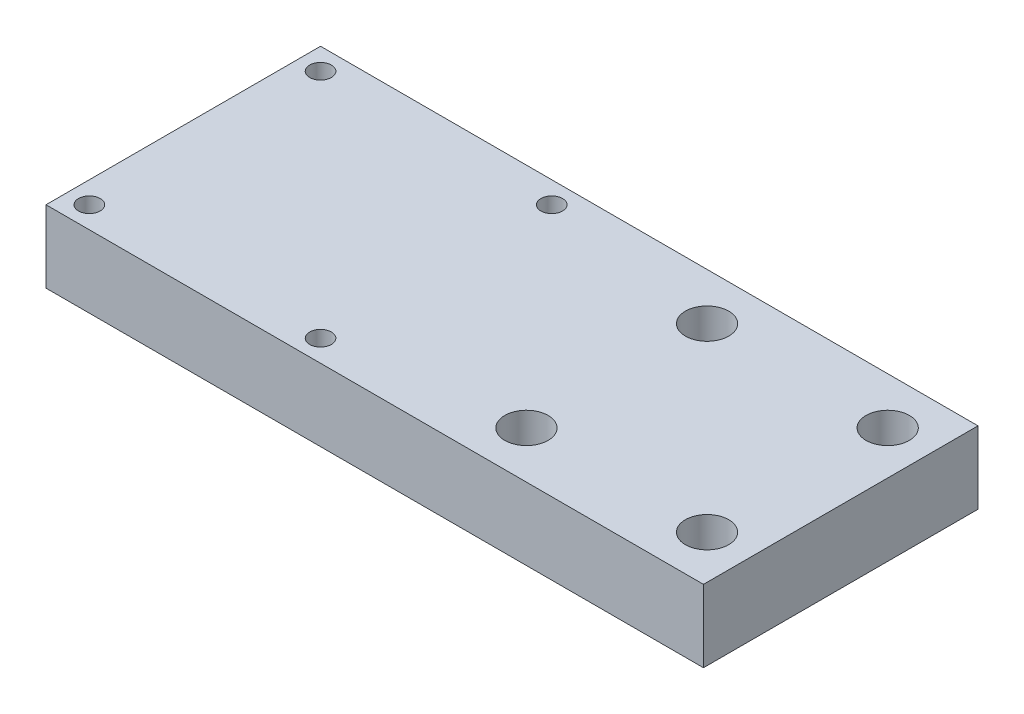
ISO-10303-21;
HEADER;
FILE_DESCRIPTION(('STEP AP214'),'2;1');
FILE_NAME('part.step','',(''),(''),'','','');
FILE_SCHEMA(('AUTOMOTIVE_DESIGN { 1 0 10303 214 1 1 1 1 }'));
ENDSEC;
DATA;
#1=APPLICATION_CONTEXT('core data for automotive mechanical design processes');
#2=APPLICATION_PROTOCOL_DEFINITION('international standard','automotive_design',2000,#1);
#3=PRODUCT_CONTEXT('',#1,'mechanical');
#4=PRODUCT('Part','Part','',(#3));
#5=PRODUCT_RELATED_PRODUCT_CATEGORY('part','',(#4));
#6=PRODUCT_DEFINITION_FORMATION('','',#4);
#7=PRODUCT_DEFINITION_CONTEXT('part definition',#1,'design');
#8=PRODUCT_DEFINITION('design','',#6,#7);
#9=PRODUCT_DEFINITION_SHAPE('','',#8);
#10=(LENGTH_UNIT() NAMED_UNIT(*) SI_UNIT(.MILLI.,.METRE.));
#11=(NAMED_UNIT(*) PLANE_ANGLE_UNIT() SI_UNIT($,.RADIAN.));
#12=(NAMED_UNIT(*) SI_UNIT($,.STERADIAN.) SOLID_ANGLE_UNIT());
#13=UNCERTAINTY_MEASURE_WITH_UNIT(LENGTH_MEASURE(1.E-05),#10,'distance_accuracy_value','');
#14=(GEOMETRIC_REPRESENTATION_CONTEXT(3) GLOBAL_UNCERTAINTY_ASSIGNED_CONTEXT((#13)) GLOBAL_UNIT_ASSIGNED_CONTEXT((#10,
#11,#12)) REPRESENTATION_CONTEXT('',''));
#15=CARTESIAN_POINT('',(0.,0.,0.));
#16=DIRECTION('',(0.,0.,1.));
#17=DIRECTION('',(1.,0.,0.));
#18=AXIS2_PLACEMENT_3D('',#15,#16,#17);
#19=CARTESIAN_POINT('',(0.,10.,0.));
#20=DIRECTION('',(0.,-1.,0.));
#21=DIRECTION('',(0.,0.,-1.));
#22=AXIS2_PLACEMENT_3D('',#19,#20,#21);
#23=PLANE('',#22);
#24=DIRECTION('',(0.,0.,1.));
#25=VECTOR('',#24,1.);
#26=CARTESIAN_POINT('',(-18.9695021838503,10.,35.35946325853));
#27=LINE('',#26,#25);
#28=CARTESIAN_POINT('',(-18.9695021838503,10.,-2.64053674146996));
#29=VERTEX_POINT('',#28);
#30=CARTESIAN_POINT('',(-18.9695021838503,10.,35.35946325853));
#31=VERTEX_POINT('',#30);
#32=EDGE_CURVE('E84',#29,#31,#27,.T.);
#33=ORIENTED_EDGE('',*,*,#32,.T.);
#34=DIRECTION('',(1.,0.,0.));
#35=VECTOR('',#34,1.);
#36=CARTESIAN_POINT('',(-18.9695021838503,10.,35.35946325853));
#37=LINE('',#36,#35);
#38=CARTESIAN_POINT('',(72.0304978161497,10.,35.35946325853));
#39=VERTEX_POINT('',#38);
#40=EDGE_CURVE('E79',#31,#39,#37,.T.);
#41=ORIENTED_EDGE('',*,*,#40,.T.);
#42=DIRECTION('',(0.,0.,-1.));
#43=VECTOR('',#42,1.);
#44=CARTESIAN_POINT('',(72.0304978161497,10.,35.35946325853));
#45=LINE('',#44,#43);
#46=CARTESIAN_POINT('',(72.0304978161497,10.,-2.64053674146996));
#47=VERTEX_POINT('',#46);
#48=EDGE_CURVE('E82',#39,#47,#45,.T.);
#49=ORIENTED_EDGE('',*,*,#48,.T.);
#50=DIRECTION('',(-1.,0.,0.));
#51=VECTOR('',#50,1.);
#52=CARTESIAN_POINT('',(-18.9695021838503,10.,-2.64053674146996));
#53=LINE('',#52,#51);
#54=EDGE_CURVE('E49',#47,#29,#53,.T.);
#55=ORIENTED_EDGE('',*,*,#54,.T.);
#56=EDGE_LOOP('',(#33,#41,#49,#55));
#57=FACE_BOUND('',#56,.T.);
#58=CARTESIAN_POINT('',(-15.9695021838503,10.,0.359463258530042));
#59=DIRECTION('',(0.,1.,0.));
#60=DIRECTION('',(0.,0.,1.));
#61=AXIS2_PLACEMENT_3D('',#58,#59,#60);
#62=CIRCLE('',#61,1.5);
#63=CARTESIAN_POINT('',(-15.9695021838503,10.,1.85946325853004));
#64=VERTEX_POINT('',#63);
#65=EDGE_CURVE('E99',#64,#64,#62,.T.);
#66=ORIENTED_EDGE('',*,*,#65,.F.);
#67=EDGE_LOOP('',(#66));
#68=FACE_BOUND('',#67,.T.);
#69=CARTESIAN_POINT('',(16.0304978161497,10.,0.359463258530042));
#70=DIRECTION('',(0.,1.,0.));
#71=DIRECTION('',(0.,0.,1.));
#72=AXIS2_PLACEMENT_3D('',#69,#70,#71);
#73=CIRCLE('',#72,1.5);
#74=CARTESIAN_POINT('',(16.0304978161497,10.,1.85946325853004));
#75=VERTEX_POINT('',#74);
#76=EDGE_CURVE('E114',#75,#75,#73,.T.);
#77=ORIENTED_EDGE('',*,*,#76,.F.);
#78=EDGE_LOOP('',(#77));
#79=FACE_BOUND('',#78,.T.);
#80=CARTESIAN_POINT('',(16.0304978161497,10.,32.35946325853));
#81=DIRECTION('',(0.,1.,0.));
#82=DIRECTION('',(0.,0.,1.));
#83=AXIS2_PLACEMENT_3D('',#80,#81,#82);
#84=CIRCLE('',#83,1.5);
#85=CARTESIAN_POINT('',(16.0304978161497,10.,33.85946325853));
#86=VERTEX_POINT('',#85);
#87=EDGE_CURVE('E120',#86,#86,#84,.T.);
#88=ORIENTED_EDGE('',*,*,#87,.F.);
#89=EDGE_LOOP('',(#88));
#90=FACE_BOUND('',#89,.T.);
#91=CARTESIAN_POINT('',(-15.9695021838503,10.,32.35946325853));
#92=DIRECTION('',(0.,1.,0.));
#93=DIRECTION('',(0.,0.,1.));
#94=AXIS2_PLACEMENT_3D('',#91,#92,#93);
#95=CIRCLE('',#94,1.5);
#96=CARTESIAN_POINT('',(-15.9695021838503,10.,33.85946325853));
#97=VERTEX_POINT('',#96);
#98=EDGE_CURVE('E126',#97,#97,#95,.T.);
#99=ORIENTED_EDGE('',*,*,#98,.F.);
#100=EDGE_LOOP('',(#99));
#101=FACE_BOUND('',#100,.T.);
#102=CARTESIAN_POINT('',(41.0304978161497,10.,3.85946325853004));
#103=DIRECTION('',(0.,1.,0.));
#104=DIRECTION('',(0.,0.,1.));
#105=AXIS2_PLACEMENT_3D('',#102,#103,#104);
#106=CIRCLE('',#105,3.00000000000001);
#107=CARTESIAN_POINT('',(41.0304978161497,10.,6.85946325853004));
#108=VERTEX_POINT('',#107);
#109=EDGE_CURVE('E132',#108,#108,#106,.T.);
#110=ORIENTED_EDGE('',*,*,#109,.F.);
#111=EDGE_LOOP('',(#110));
#112=FACE_BOUND('',#111,.T.);
#113=CARTESIAN_POINT('',(66.0304978161497,10.,3.85946325853004));
#114=DIRECTION('',(0.,1.,0.));
#115=DIRECTION('',(0.,0.,1.));
#116=AXIS2_PLACEMENT_3D('',#113,#114,#115);
#117=CIRCLE('',#116,3.00000000000001);
#118=CARTESIAN_POINT('',(66.0304978161497,10.,6.85946325853004));
#119=VERTEX_POINT('',#118);
#120=EDGE_CURVE('E138',#119,#119,#117,.T.);
#121=ORIENTED_EDGE('',*,*,#120,.F.);
#122=EDGE_LOOP('',(#121));
#123=FACE_BOUND('',#122,.T.);
#124=CARTESIAN_POINT('',(66.0304978161497,10.,28.85946325853));
#125=DIRECTION('',(0.,1.,0.));
#126=DIRECTION('',(0.,0.,1.));
#127=AXIS2_PLACEMENT_3D('',#124,#125,#126);
#128=CIRCLE('',#127,3.00000000000001);
#129=CARTESIAN_POINT('',(66.0304978161497,10.,31.85946325853));
#130=VERTEX_POINT('',#129);
#131=EDGE_CURVE('E144',#130,#130,#128,.T.);
#132=ORIENTED_EDGE('',*,*,#131,.F.);
#133=EDGE_LOOP('',(#132));
#134=FACE_BOUND('',#133,.T.);
#135=CARTESIAN_POINT('',(41.0304978161497,10.,28.85946325853));
#136=DIRECTION('',(0.,1.,0.));
#137=DIRECTION('',(0.,0.,1.));
#138=AXIS2_PLACEMENT_3D('',#135,#136,#137);
#139=CIRCLE('',#138,3.00000000000001);
#140=CARTESIAN_POINT('',(41.0304978161497,10.,31.85946325853));
#141=VERTEX_POINT('',#140);
#142=EDGE_CURVE('E150',#141,#141,#139,.T.);
#143=ORIENTED_EDGE('',*,*,#142,.F.);
#144=EDGE_LOOP('',(#143));
#145=FACE_BOUND('',#144,.T.);
#146=ADVANCED_FACE('F32',(#57,#68,#79,#90,#101,#112,#123,#134,#145),#23,.F.);
#147=CARTESIAN_POINT('',(0.,0.,0.));
#148=DIRECTION('',(0.,-1.,0.));
#149=DIRECTION('',(0.,0.,-1.));
#150=AXIS2_PLACEMENT_3D('',#147,#148,#149);
#151=PLANE('',#150);
#152=CARTESIAN_POINT('',(66.0304978161497,0.,28.85946325853));
#153=DIRECTION('',(0.,1.,0.));
#154=DIRECTION('',(0.,0.,1.));
#155=AXIS2_PLACEMENT_3D('',#152,#153,#154);
#156=CIRCLE('',#155,3.00000000000001);
#157=CARTESIAN_POINT('',(66.0304978161497,0.,31.85946325853));
#158=VERTEX_POINT('',#157);
#159=EDGE_CURVE('E147',#158,#158,#156,.T.);
#160=ORIENTED_EDGE('',*,*,#159,.T.);
#161=EDGE_LOOP('',(#160));
#162=FACE_BOUND('',#161,.T.);
#163=CARTESIAN_POINT('',(41.0304978161497,0.,3.85946325853004));
#164=DIRECTION('',(0.,1.,0.));
#165=DIRECTION('',(0.,0.,1.));
#166=AXIS2_PLACEMENT_3D('',#163,#164,#165);
#167=CIRCLE('',#166,3.00000000000001);
#168=CARTESIAN_POINT('',(41.0304978161497,0.,6.85946325853004));
#169=VERTEX_POINT('',#168);
#170=EDGE_CURVE('E135',#169,#169,#167,.T.);
#171=ORIENTED_EDGE('',*,*,#170,.T.);
#172=EDGE_LOOP('',(#171));
#173=FACE_BOUND('',#172,.T.);
#174=CARTESIAN_POINT('',(16.0304978161497,0.,32.35946325853));
#175=DIRECTION('',(0.,1.,0.));
#176=DIRECTION('',(0.,0.,1.));
#177=AXIS2_PLACEMENT_3D('',#174,#175,#176);
#178=CIRCLE('',#177,1.5);
#179=CARTESIAN_POINT('',(16.0304978161497,0.,33.85946325853));
#180=VERTEX_POINT('',#179);
#181=EDGE_CURVE('E123',#180,#180,#178,.T.);
#182=ORIENTED_EDGE('',*,*,#181,.T.);
#183=EDGE_LOOP('',(#182));
#184=FACE_BOUND('',#183,.T.);
#185=CARTESIAN_POINT('',(-15.9695021838503,0.,0.359463258530042));
#186=DIRECTION('',(0.,1.,0.));
#187=DIRECTION('',(0.,0.,1.));
#188=AXIS2_PLACEMENT_3D('',#185,#186,#187);
#189=CIRCLE('',#188,1.5);
#190=CARTESIAN_POINT('',(-15.9695021838503,0.,1.85946325853004));
#191=VERTEX_POINT('',#190);
#192=EDGE_CURVE('E111',#191,#191,#189,.T.);
#193=ORIENTED_EDGE('',*,*,#192,.T.);
#194=EDGE_LOOP('',(#193));
#195=FACE_BOUND('',#194,.T.);
#196=DIRECTION('',(0.,0.,1.));
#197=VECTOR('',#196,1.);
#198=CARTESIAN_POINT('',(-18.9695021838503,0.,35.35946325853));
#199=LINE('',#198,#197);
#200=CARTESIAN_POINT('',(-18.9695021838503,0.,-2.64053674146996));
#201=VERTEX_POINT('',#200);
#202=CARTESIAN_POINT('',(-18.9695021838503,0.,35.35946325853));
#203=VERTEX_POINT('',#202);
#204=EDGE_CURVE('E96',#201,#203,#199,.T.);
#205=ORIENTED_EDGE('',*,*,#204,.F.);
#206=DIRECTION('',(-1.,0.,0.));
#207=VECTOR('',#206,1.);
#208=CARTESIAN_POINT('',(-18.9695021838503,0.,-2.64053674146996));
#209=LINE('',#208,#207);
#210=CARTESIAN_POINT('',(72.0304978161497,0.,-2.64053674146996));
#211=VERTEX_POINT('',#210);
#212=EDGE_CURVE('E72',#211,#201,#209,.T.);
#213=ORIENTED_EDGE('',*,*,#212,.F.);
#214=DIRECTION('',(0.,0.,-1.));
#215=VECTOR('',#214,1.);
#216=CARTESIAN_POINT('',(72.0304978161497,0.,35.35946325853));
#217=LINE('',#216,#215);
#218=CARTESIAN_POINT('',(72.0304978161497,0.,35.35946325853));
#219=VERTEX_POINT('',#218);
#220=EDGE_CURVE('E66',#219,#211,#217,.T.);
#221=ORIENTED_EDGE('',*,*,#220,.F.);
#222=DIRECTION('',(1.,0.,0.));
#223=VECTOR('',#222,1.);
#224=CARTESIAN_POINT('',(-18.9695021838503,0.,35.35946325853));
#225=LINE('',#224,#223);
#226=EDGE_CURVE('E88',#203,#219,#225,.T.);
#227=ORIENTED_EDGE('',*,*,#226,.F.);
#228=EDGE_LOOP('',(#205,#213,#221,#227));
#229=FACE_BOUND('',#228,.T.);
#230=CARTESIAN_POINT('',(16.0304978161497,0.,0.359463258530042));
#231=DIRECTION('',(0.,1.,0.));
#232=DIRECTION('',(0.,0.,1.));
#233=AXIS2_PLACEMENT_3D('',#230,#231,#232);
#234=CIRCLE('',#233,1.5);
#235=CARTESIAN_POINT('',(16.0304978161497,0.,1.85946325853004));
#236=VERTEX_POINT('',#235);
#237=EDGE_CURVE('E117',#236,#236,#234,.T.);
#238=ORIENTED_EDGE('',*,*,#237,.T.);
#239=EDGE_LOOP('',(#238));
#240=FACE_BOUND('',#239,.T.);
#241=CARTESIAN_POINT('',(-15.9695021838503,0.,32.35946325853));
#242=DIRECTION('',(0.,1.,0.));
#243=DIRECTION('',(0.,0.,1.));
#244=AXIS2_PLACEMENT_3D('',#241,#242,#243);
#245=CIRCLE('',#244,1.5);
#246=CARTESIAN_POINT('',(-15.9695021838503,0.,33.85946325853));
#247=VERTEX_POINT('',#246);
#248=EDGE_CURVE('E129',#247,#247,#245,.T.);
#249=ORIENTED_EDGE('',*,*,#248,.T.);
#250=EDGE_LOOP('',(#249));
#251=FACE_BOUND('',#250,.T.);
#252=CARTESIAN_POINT('',(66.0304978161497,0.,3.85946325853004));
#253=DIRECTION('',(0.,1.,0.));
#254=DIRECTION('',(0.,0.,1.));
#255=AXIS2_PLACEMENT_3D('',#252,#253,#254);
#256=CIRCLE('',#255,3.00000000000001);
#257=CARTESIAN_POINT('',(66.0304978161497,0.,6.85946325853004));
#258=VERTEX_POINT('',#257);
#259=EDGE_CURVE('E141',#258,#258,#256,.T.);
#260=ORIENTED_EDGE('',*,*,#259,.T.);
#261=EDGE_LOOP('',(#260));
#262=FACE_BOUND('',#261,.T.);
#263=CARTESIAN_POINT('',(41.0304978161497,0.,28.85946325853));
#264=DIRECTION('',(0.,1.,0.));
#265=DIRECTION('',(0.,0.,1.));
#266=AXIS2_PLACEMENT_3D('',#263,#264,#265);
#267=CIRCLE('',#266,3.00000000000001);
#268=CARTESIAN_POINT('',(41.0304978161497,0.,31.85946325853));
#269=VERTEX_POINT('',#268);
#270=EDGE_CURVE('E153',#269,#269,#267,.T.);
#271=ORIENTED_EDGE('',*,*,#270,.T.);
#272=EDGE_LOOP('',(#271));
#273=FACE_BOUND('',#272,.T.);
#274=ADVANCED_FACE('F107',(#162,#173,#184,#195,#229,#240,#251,#262,#273),#151,.T.);
#275=CARTESIAN_POINT('',(-18.9695021838503,10.,35.35946325853));
#276=DIRECTION('',(1.,0.,0.));
#277=DIRECTION('',(0.,0.,-1.));
#278=AXIS2_PLACEMENT_3D('',#275,#276,#277);
#279=PLANE('',#278);
#280=ORIENTED_EDGE('',*,*,#204,.T.);
#281=DIRECTION('',(0.,-1.,0.));
#282=VECTOR('',#281,1.);
#283=CARTESIAN_POINT('',(-18.9695021838503,10.,35.35946325853));
#284=LINE('',#283,#282);
#285=EDGE_CURVE('E11',#31,#203,#284,.T.);
#286=ORIENTED_EDGE('',*,*,#285,.F.);
#287=ORIENTED_EDGE('',*,*,#32,.F.);
#288=DIRECTION('',(0.,-1.,0.));
#289=VECTOR('',#288,1.);
#290=CARTESIAN_POINT('',(-18.9695021838503,10.,-2.64053674146996));
#291=LINE('',#290,#289);
#292=EDGE_CURVE('E92',#29,#201,#291,.T.);
#293=ORIENTED_EDGE('',*,*,#292,.T.);
#294=EDGE_LOOP('',(#280,#286,#287,#293));
#295=FACE_BOUND('',#294,.T.);
#296=ADVANCED_FACE('F34',(#295),#279,.F.);
#297=CARTESIAN_POINT('',(-18.9695021838503,10.,35.35946325853));
#298=DIRECTION('',(0.,0.,-1.));
#299=DIRECTION('',(-1.,0.,0.));
#300=AXIS2_PLACEMENT_3D('',#297,#298,#299);
#301=PLANE('',#300);
#302=ORIENTED_EDGE('',*,*,#226,.T.);
#303=DIRECTION('',(0.,-1.,0.));
#304=VECTOR('',#303,1.);
#305=CARTESIAN_POINT('',(72.0304978161497,10.,35.35946325853));
#306=LINE('',#305,#304);
#307=EDGE_CURVE('E41',#39,#219,#306,.T.);
#308=ORIENTED_EDGE('',*,*,#307,.F.);
#309=ORIENTED_EDGE('',*,*,#40,.F.);
#310=ORIENTED_EDGE('',*,*,#285,.T.);
#311=EDGE_LOOP('',(#302,#308,#309,#310));
#312=FACE_BOUND('',#311,.T.);
#313=ADVANCED_FACE('F87',(#312),#301,.F.);
#314=CARTESIAN_POINT('',(72.0304978161497,10.,35.35946325853));
#315=DIRECTION('',(-1.,0.,0.));
#316=DIRECTION('',(0.,0.,1.));
#317=AXIS2_PLACEMENT_3D('',#314,#315,#316);
#318=PLANE('',#317);
#319=ORIENTED_EDGE('',*,*,#220,.T.);
#320=DIRECTION('',(0.,-1.,0.));
#321=VECTOR('',#320,1.);
#322=CARTESIAN_POINT('',(72.0304978161497,10.,-2.64053674146996));
#323=LINE('',#322,#321);
#324=EDGE_CURVE('E89',#47,#211,#323,.T.);
#325=ORIENTED_EDGE('',*,*,#324,.F.);
#326=ORIENTED_EDGE('',*,*,#48,.F.);
#327=ORIENTED_EDGE('',*,*,#307,.T.);
#328=EDGE_LOOP('',(#319,#325,#326,#327));
#329=FACE_BOUND('',#328,.T.);
#330=ADVANCED_FACE('F90',(#329),#318,.F.);
#331=CARTESIAN_POINT('',(-18.9695021838503,10.,-2.64053674146996));
#332=DIRECTION('',(0.,0.,1.));
#333=DIRECTION('',(1.,0.,0.));
#334=AXIS2_PLACEMENT_3D('',#331,#332,#333);
#335=PLANE('',#334);
#336=ORIENTED_EDGE('',*,*,#212,.T.);
#337=ORIENTED_EDGE('',*,*,#292,.F.);
#338=ORIENTED_EDGE('',*,*,#54,.F.);
#339=ORIENTED_EDGE('',*,*,#324,.T.);
#340=EDGE_LOOP('',(#336,#337,#338,#339));
#341=FACE_BOUND('',#340,.T.);
#342=ADVANCED_FACE('F104',(#341),#335,.F.);
#343=CARTESIAN_POINT('',(-15.9695021838503,10.,0.359463258530042));
#344=DIRECTION('',(0.,-1.,0.));
#345=DIRECTION('',(0.,0.,-1.));
#346=AXIS2_PLACEMENT_3D('',#343,#344,#345);
#347=CYLINDRICAL_SURFACE('',#346,1.5);
#348=ORIENTED_EDGE('',*,*,#65,.T.);
#349=EDGE_LOOP('',(#348));
#350=FACE_BOUND('',#349,.T.);
#351=ORIENTED_EDGE('',*,*,#192,.F.);
#352=EDGE_LOOP('',(#351));
#353=FACE_BOUND('',#352,.T.);
#354=ADVANCED_FACE('F170',(#350,#353),#347,.F.);
#355=CARTESIAN_POINT('',(16.0304978161497,10.,0.359463258530042));
#356=DIRECTION('',(0.,-1.,0.));
#357=DIRECTION('',(0.,0.,-1.));
#358=AXIS2_PLACEMENT_3D('',#355,#356,#357);
#359=CYLINDRICAL_SURFACE('',#358,1.5);
#360=ORIENTED_EDGE('',*,*,#76,.T.);
#361=EDGE_LOOP('',(#360));
#362=FACE_BOUND('',#361,.T.);
#363=ORIENTED_EDGE('',*,*,#237,.F.);
#364=EDGE_LOOP('',(#363));
#365=FACE_BOUND('',#364,.T.);
#366=ADVANCED_FACE('F216',(#362,#365),#359,.F.);
#367=CARTESIAN_POINT('',(16.0304978161497,10.,32.35946325853));
#368=DIRECTION('',(0.,-1.,0.));
#369=DIRECTION('',(0.,0.,-1.));
#370=AXIS2_PLACEMENT_3D('',#367,#368,#369);
#371=CYLINDRICAL_SURFACE('',#370,1.5);
#372=ORIENTED_EDGE('',*,*,#87,.T.);
#373=EDGE_LOOP('',(#372));
#374=FACE_BOUND('',#373,.T.);
#375=ORIENTED_EDGE('',*,*,#181,.F.);
#376=EDGE_LOOP('',(#375));
#377=FACE_BOUND('',#376,.T.);
#378=ADVANCED_FACE('F224',(#374,#377),#371,.F.);
#379=CARTESIAN_POINT('',(-15.9695021838503,10.,32.35946325853));
#380=DIRECTION('',(0.,-1.,0.));
#381=DIRECTION('',(0.,0.,-1.));
#382=AXIS2_PLACEMENT_3D('',#379,#380,#381);
#383=CYLINDRICAL_SURFACE('',#382,1.5);
#384=ORIENTED_EDGE('',*,*,#98,.T.);
#385=EDGE_LOOP('',(#384));
#386=FACE_BOUND('',#385,.T.);
#387=ORIENTED_EDGE('',*,*,#248,.F.);
#388=EDGE_LOOP('',(#387));
#389=FACE_BOUND('',#388,.T.);
#390=ADVANCED_FACE('F232',(#386,#389),#383,.F.);
#391=CARTESIAN_POINT('',(41.0304978161497,10.,3.85946325853004));
#392=DIRECTION('',(0.,-1.,0.));
#393=DIRECTION('',(0.,0.,-1.));
#394=AXIS2_PLACEMENT_3D('',#391,#392,#393);
#395=CYLINDRICAL_SURFACE('',#394,3.00000000000001);
#396=ORIENTED_EDGE('',*,*,#109,.T.);
#397=EDGE_LOOP('',(#396));
#398=FACE_BOUND('',#397,.T.);
#399=ORIENTED_EDGE('',*,*,#170,.F.);
#400=EDGE_LOOP('',(#399));
#401=FACE_BOUND('',#400,.T.);
#402=ADVANCED_FACE('F241',(#398,#401),#395,.F.);
#403=CARTESIAN_POINT('',(66.0304978161497,10.,3.85946325853004));
#404=DIRECTION('',(0.,-1.,0.));
#405=DIRECTION('',(0.,0.,-1.));
#406=AXIS2_PLACEMENT_3D('',#403,#404,#405);
#407=CYLINDRICAL_SURFACE('',#406,3.00000000000001);
#408=ORIENTED_EDGE('',*,*,#120,.T.);
#409=EDGE_LOOP('',(#408));
#410=FACE_BOUND('',#409,.T.);
#411=ORIENTED_EDGE('',*,*,#259,.F.);
#412=EDGE_LOOP('',(#411));
#413=FACE_BOUND('',#412,.T.);
#414=ADVANCED_FACE('F250',(#410,#413),#407,.F.);
#415=CARTESIAN_POINT('',(66.0304978161497,10.,28.85946325853));
#416=DIRECTION('',(0.,-1.,0.));
#417=DIRECTION('',(0.,0.,-1.));
#418=AXIS2_PLACEMENT_3D('',#415,#416,#417);
#419=CYLINDRICAL_SURFACE('',#418,3.00000000000001);
#420=ORIENTED_EDGE('',*,*,#131,.T.);
#421=EDGE_LOOP('',(#420));
#422=FACE_BOUND('',#421,.T.);
#423=ORIENTED_EDGE('',*,*,#159,.F.);
#424=EDGE_LOOP('',(#423));
#425=FACE_BOUND('',#424,.T.);
#426=ADVANCED_FACE('F259',(#422,#425),#419,.F.);
#427=CARTESIAN_POINT('',(41.0304978161497,10.,28.85946325853));
#428=DIRECTION('',(0.,-1.,0.));
#429=DIRECTION('',(0.,0.,-1.));
#430=AXIS2_PLACEMENT_3D('',#427,#428,#429);
#431=CYLINDRICAL_SURFACE('',#430,3.00000000000001);
#432=ORIENTED_EDGE('',*,*,#142,.T.);
#433=EDGE_LOOP('',(#432));
#434=FACE_BOUND('',#433,.T.);
#435=ORIENTED_EDGE('',*,*,#270,.F.);
#436=EDGE_LOOP('',(#435));
#437=FACE_BOUND('',#436,.T.);
#438=ADVANCED_FACE('F159',(#434,#437),#431,.F.);
#439=CLOSED_SHELL('',(#146,#274,#296,#313,#330,#342,#354,#366,#378,#390,#402,#414,#426,#438));
#440=MANIFOLD_SOLID_BREP('B2',#439);
#441=ADVANCED_BREP_SHAPE_REPRESENTATION('',(#18,#440),#14);
#442=SHAPE_DEFINITION_REPRESENTATION(#9,#441);
ENDSEC;
END-ISO-10303-21;
